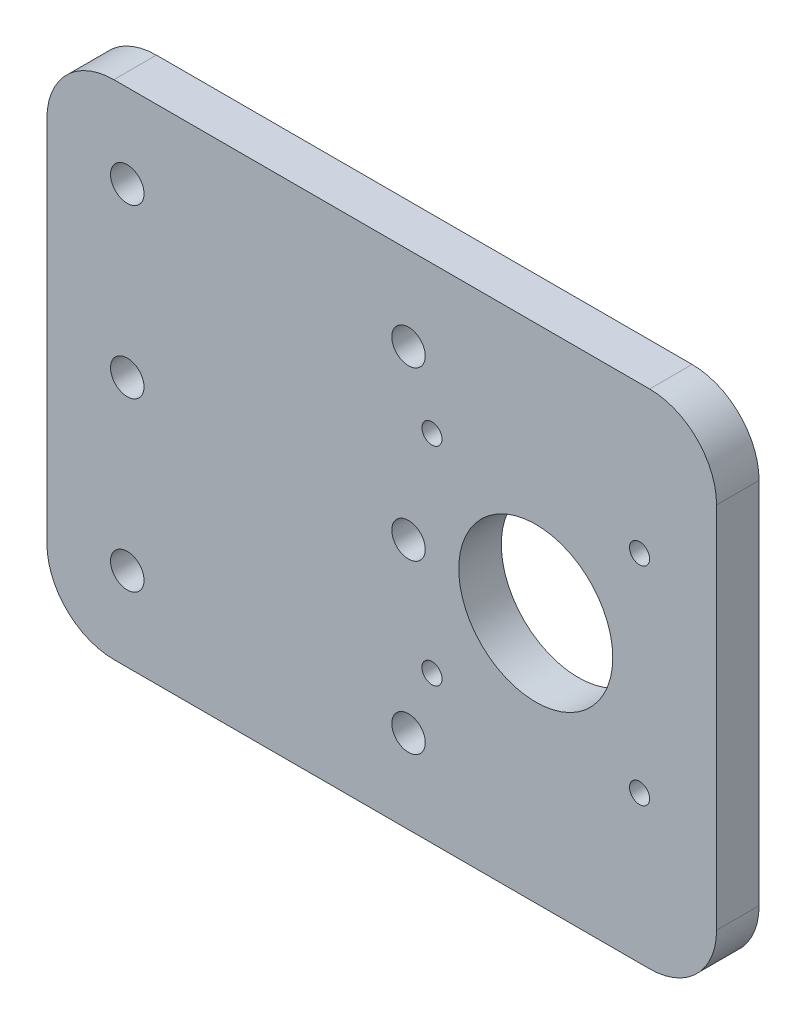
ISO-10303-21;
HEADER;
FILE_DESCRIPTION(('STEP AP214'),'2;1');
FILE_NAME('part.step','',(''),(''),'','','');
FILE_SCHEMA(('AUTOMOTIVE_DESIGN { 1 0 10303 214 1 1 1 1 }'));
ENDSEC;
DATA;
#1=APPLICATION_CONTEXT('core data for automotive mechanical design processes');
#2=APPLICATION_PROTOCOL_DEFINITION('international standard','automotive_design',2000,#1);
#3=PRODUCT_CONTEXT('',#1,'mechanical');
#4=PRODUCT('Part','Part','',(#3));
#5=PRODUCT_RELATED_PRODUCT_CATEGORY('part','',(#4));
#6=PRODUCT_DEFINITION_FORMATION('','',#4);
#7=PRODUCT_DEFINITION_CONTEXT('part definition',#1,'design');
#8=PRODUCT_DEFINITION('design','',#6,#7);
#9=PRODUCT_DEFINITION_SHAPE('','',#8);
#10=(LENGTH_UNIT() NAMED_UNIT(*) SI_UNIT(.MILLI.,.METRE.));
#11=(NAMED_UNIT(*) PLANE_ANGLE_UNIT() SI_UNIT($,.RADIAN.));
#12=(NAMED_UNIT(*) SI_UNIT($,.STERADIAN.) SOLID_ANGLE_UNIT());
#13=UNCERTAINTY_MEASURE_WITH_UNIT(LENGTH_MEASURE(1.E-05),#10,'distance_accuracy_value','');
#14=(GEOMETRIC_REPRESENTATION_CONTEXT(3) GLOBAL_UNCERTAINTY_ASSIGNED_CONTEXT((#13)) GLOBAL_UNIT_ASSIGNED_CONTEXT((#10,
#11,#12)) REPRESENTATION_CONTEXT('',''));
#15=CARTESIAN_POINT('',(0.,0.,0.));
#16=DIRECTION('',(0.,0.,1.));
#17=DIRECTION('',(1.,0.,0.));
#18=AXIS2_PLACEMENT_3D('',#15,#16,#17);
#19=CARTESIAN_POINT('',(0.,0.,6.35));
#20=DIRECTION('',(1.,0.,0.));
#21=DIRECTION('',(0.,0.,-1.));
#22=AXIS2_PLACEMENT_3D('',#19,#20,#21);
#23=PLANE('',#22);
#24=DIRECTION('',(0.,-1.,0.));
#25=VECTOR('',#24,1.);
#26=CARTESIAN_POINT('',(0.,0.,6.35));
#27=LINE('',#26,#25);
#28=CARTESIAN_POINT('',(0.,65.,6.35));
#29=VERTEX_POINT('',#28);
#30=CARTESIAN_POINT('',(0.,10.,6.35));
#31=VERTEX_POINT('',#30);
#32=EDGE_CURVE('E126',#29,#31,#27,.T.);
#33=ORIENTED_EDGE('',*,*,#32,.F.);
#34=DIRECTION('',(0.,0.,-1.));
#35=VECTOR('',#34,1.);
#36=CARTESIAN_POINT('',(0.,65.,6.35));
#37=LINE('',#36,#35);
#38=CARTESIAN_POINT('',(0.,65.,0.));
#39=VERTEX_POINT('',#38);
#40=EDGE_CURVE('E110',#29,#39,#37,.T.);
#41=ORIENTED_EDGE('',*,*,#40,.T.);
#42=DIRECTION('',(0.,-1.,0.));
#43=VECTOR('',#42,1.);
#44=CARTESIAN_POINT('',(0.,0.,0.));
#45=LINE('',#44,#43);
#46=CARTESIAN_POINT('',(0.,10.,0.));
#47=VERTEX_POINT('',#46);
#48=EDGE_CURVE('E123',#39,#47,#45,.T.);
#49=ORIENTED_EDGE('',*,*,#48,.T.);
#50=DIRECTION('',(0.,0.,-1.));
#51=VECTOR('',#50,1.);
#52=CARTESIAN_POINT('',(0.,10.,6.35));
#53=LINE('',#52,#51);
#54=EDGE_CURVE('E129',#47,#31,#53,.F.);
#55=ORIENTED_EDGE('',*,*,#54,.T.);
#56=EDGE_LOOP('',(#33,#41,#49,#55));
#57=FACE_BOUND('',#56,.T.);
#58=ADVANCED_FACE('F39',(#57),#23,.F.);
#59=CARTESIAN_POINT('',(0.,0.,6.35));
#60=DIRECTION('',(0.,1.,0.));
#61=DIRECTION('',(0.,0.,1.));
#62=AXIS2_PLACEMENT_3D('',#59,#60,#61);
#63=PLANE('',#62);
#64=DIRECTION('',(1.,0.,0.));
#65=VECTOR('',#64,1.);
#66=CARTESIAN_POINT('',(0.,0.,0.));
#67=LINE('',#66,#65);
#68=CARTESIAN_POINT('',(10.,0.,0.));
#69=VERTEX_POINT('',#68);
#70=CARTESIAN_POINT('',(90.,0.,0.));
#71=VERTEX_POINT('',#70);
#72=EDGE_CURVE('E135',#69,#71,#67,.T.);
#73=ORIENTED_EDGE('',*,*,#72,.T.);
#74=DIRECTION('',(0.,0.,-1.));
#75=VECTOR('',#74,1.);
#76=CARTESIAN_POINT('',(90.,0.,6.35));
#77=LINE('',#76,#75);
#78=CARTESIAN_POINT('',(90.,0.,6.35));
#79=VERTEX_POINT('',#78);
#80=EDGE_CURVE('E11',#71,#79,#77,.F.);
#81=ORIENTED_EDGE('',*,*,#80,.T.);
#82=DIRECTION('',(1.,0.,0.));
#83=VECTOR('',#82,1.);
#84=CARTESIAN_POINT('',(0.,0.,6.35));
#85=LINE('',#84,#83);
#86=CARTESIAN_POINT('',(10.,0.,6.35));
#87=VERTEX_POINT('',#86);
#88=EDGE_CURVE('E223',#87,#79,#85,.T.);
#89=ORIENTED_EDGE('',*,*,#88,.F.);
#90=DIRECTION('',(0.,0.,-1.));
#91=VECTOR('',#90,1.);
#92=CARTESIAN_POINT('',(10.,0.,6.35));
#93=LINE('',#92,#91);
#94=EDGE_CURVE('E48',#87,#69,#93,.T.);
#95=ORIENTED_EDGE('',*,*,#94,.T.);
#96=EDGE_LOOP('',(#73,#81,#89,#95));
#97=FACE_BOUND('',#96,.T.);
#98=ADVANCED_FACE('F221',(#97),#63,.F.);
#99=CARTESIAN_POINT('',(100.,0.,6.35));
#100=DIRECTION('',(-1.,0.,0.));
#101=DIRECTION('',(0.,0.,1.));
#102=AXIS2_PLACEMENT_3D('',#99,#100,#101);
#103=PLANE('',#102);
#104=DIRECTION('',(0.,1.,0.));
#105=VECTOR('',#104,1.);
#106=CARTESIAN_POINT('',(100.,0.,6.35));
#107=LINE('',#106,#105);
#108=CARTESIAN_POINT('',(100.,10.,6.35));
#109=VERTEX_POINT('',#108);
#110=CARTESIAN_POINT('',(100.,65.,6.35));
#111=VERTEX_POINT('',#110);
#112=EDGE_CURVE('E231',#109,#111,#107,.T.);
#113=ORIENTED_EDGE('',*,*,#112,.F.);
#114=DIRECTION('',(0.,0.,-1.));
#115=VECTOR('',#114,1.);
#116=CARTESIAN_POINT('',(100.,10.,6.35));
#117=LINE('',#116,#115);
#118=CARTESIAN_POINT('',(100.,10.,0.));
#119=VERTEX_POINT('',#118);
#120=EDGE_CURVE('E213',#109,#119,#117,.T.);
#121=ORIENTED_EDGE('',*,*,#120,.T.);
#122=DIRECTION('',(0.,1.,0.));
#123=VECTOR('',#122,1.);
#124=CARTESIAN_POINT('',(100.,0.,0.));
#125=LINE('',#124,#123);
#126=CARTESIAN_POINT('',(100.,65.,0.));
#127=VERTEX_POINT('',#126);
#128=EDGE_CURVE('E141',#119,#127,#125,.T.);
#129=ORIENTED_EDGE('',*,*,#128,.T.);
#130=DIRECTION('',(0.,0.,-1.));
#131=VECTOR('',#130,1.);
#132=CARTESIAN_POINT('',(100.,65.,6.35));
#133=LINE('',#132,#131);
#134=EDGE_CURVE('E55',#127,#111,#133,.F.);
#135=ORIENTED_EDGE('',*,*,#134,.T.);
#136=EDGE_LOOP('',(#113,#121,#129,#135));
#137=FACE_BOUND('',#136,.T.);
#138=ADVANCED_FACE('F230',(#137),#103,.F.);
#139=CARTESIAN_POINT('',(0.,75.,6.35));
#140=DIRECTION('',(0.,-1.,0.));
#141=DIRECTION('',(0.,0.,-1.));
#142=AXIS2_PLACEMENT_3D('',#139,#140,#141);
#143=PLANE('',#142);
#144=DIRECTION('',(-1.,0.,0.));
#145=VECTOR('',#144,1.);
#146=CARTESIAN_POINT('',(0.,75.,0.));
#147=LINE('',#146,#145);
#148=CARTESIAN_POINT('',(90.,75.,0.));
#149=VERTEX_POINT('',#148);
#150=CARTESIAN_POINT('',(10.,75.,0.));
#151=VERTEX_POINT('',#150);
#152=EDGE_CURVE('E152',#149,#151,#147,.T.);
#153=ORIENTED_EDGE('',*,*,#152,.T.);
#154=DIRECTION('',(0.,0.,-1.));
#155=VECTOR('',#154,1.);
#156=CARTESIAN_POINT('',(10.,75.,6.35));
#157=LINE('',#156,#155);
#158=CARTESIAN_POINT('',(10.,75.,6.35));
#159=VERTEX_POINT('',#158);
#160=EDGE_CURVE('E111',#151,#159,#157,.F.);
#161=ORIENTED_EDGE('',*,*,#160,.T.);
#162=DIRECTION('',(-1.,0.,0.));
#163=VECTOR('',#162,1.);
#164=CARTESIAN_POINT('',(0.,75.,6.35));
#165=LINE('',#164,#163);
#166=CARTESIAN_POINT('',(90.,75.,6.35));
#167=VERTEX_POINT('',#166);
#168=EDGE_CURVE('E147',#167,#159,#165,.T.);
#169=ORIENTED_EDGE('',*,*,#168,.F.);
#170=DIRECTION('',(0.,0.,-1.));
#171=VECTOR('',#170,1.);
#172=CARTESIAN_POINT('',(90.,75.,6.35));
#173=LINE('',#172,#171);
#174=EDGE_CURVE('E117',#167,#149,#173,.T.);
#175=ORIENTED_EDGE('',*,*,#174,.T.);
#176=EDGE_LOOP('',(#153,#161,#169,#175));
#177=FACE_BOUND('',#176,.T.);
#178=ADVANCED_FACE('F314',(#177),#143,.F.);
#179=CARTESIAN_POINT('',(0.,0.,6.35));
#180=DIRECTION('',(0.,0.,-1.));
#181=DIRECTION('',(-1.,0.,0.));
#182=AXIS2_PLACEMENT_3D('',#179,#180,#181);
#183=PLANE('',#182);
#184=CARTESIAN_POINT('',(57.5,53.,6.35));
#185=DIRECTION('',(0.,0.,1.));
#186=DIRECTION('',(1.,0.,0.));
#187=AXIS2_PLACEMENT_3D('',#184,#185,#186);
#188=CIRCLE('',#187,1.5);
#189=CARTESIAN_POINT('',(59.,53.,6.35));
#190=VERTEX_POINT('',#189);
#191=EDGE_CURVE('E288',#190,#190,#188,.T.);
#192=ORIENTED_EDGE('',*,*,#191,.F.);
#193=EDGE_LOOP('',(#192));
#194=FACE_BOUND('',#193,.T.);
#195=CARTESIAN_POINT('',(88.5,22.,6.35));
#196=DIRECTION('',(0.,0.,1.));
#197=DIRECTION('',(1.,0.,0.));
#198=AXIS2_PLACEMENT_3D('',#195,#196,#197);
#199=CIRCLE('',#198,1.5);
#200=CARTESIAN_POINT('',(90.,22.,6.35));
#201=VERTEX_POINT('',#200);
#202=EDGE_CURVE('E289',#201,#201,#199,.T.);
#203=ORIENTED_EDGE('',*,*,#202,.F.);
#204=EDGE_LOOP('',(#203));
#205=FACE_BOUND('',#204,.T.);
#206=CARTESIAN_POINT('',(57.5,22.,6.35));
#207=DIRECTION('',(0.,0.,1.));
#208=DIRECTION('',(1.,0.,0.));
#209=AXIS2_PLACEMENT_3D('',#206,#207,#208);
#210=CIRCLE('',#209,1.5);
#211=CARTESIAN_POINT('',(59.,22.,6.35));
#212=VERTEX_POINT('',#211);
#213=EDGE_CURVE('E293',#212,#212,#210,.T.);
#214=ORIENTED_EDGE('',*,*,#213,.F.);
#215=EDGE_LOOP('',(#214));
#216=FACE_BOUND('',#215,.T.);
#217=CARTESIAN_POINT('',(73.,37.5,6.35));
#218=DIRECTION('',(0.,0.,1.));
#219=DIRECTION('',(1.,0.,0.));
#220=AXIS2_PLACEMENT_3D('',#217,#218,#219);
#221=CIRCLE('',#220,11.5);
#222=CARTESIAN_POINT('',(84.5,37.5,6.35));
#223=VERTEX_POINT('',#222);
#224=EDGE_CURVE('E297',#223,#223,#221,.T.);
#225=ORIENTED_EDGE('',*,*,#224,.F.);
#226=EDGE_LOOP('',(#225));
#227=FACE_BOUND('',#226,.T.);
#228=CARTESIAN_POINT('',(88.5,53.,6.35));
#229=DIRECTION('',(0.,0.,1.));
#230=DIRECTION('',(1.,0.,0.));
#231=AXIS2_PLACEMENT_3D('',#228,#229,#230);
#232=CIRCLE('',#231,1.5);
#233=CARTESIAN_POINT('',(90.,53.,6.35));
#234=VERTEX_POINT('',#233);
#235=EDGE_CURVE('E281',#234,#234,#232,.T.);
#236=ORIENTED_EDGE('',*,*,#235,.F.);
#237=EDGE_LOOP('',(#236));
#238=FACE_BOUND('',#237,.T.);
#239=CARTESIAN_POINT('',(12.,37.5,6.35));
#240=DIRECTION('',(0.,0.,1.));
#241=DIRECTION('',(1.,0.,0.));
#242=AXIS2_PLACEMENT_3D('',#239,#240,#241);
#243=CIRCLE('',#242,2.5);
#244=CARTESIAN_POINT('',(14.5,37.5,6.35));
#245=VERTEX_POINT('',#244);
#246=EDGE_CURVE('E261',#245,#245,#243,.T.);
#247=ORIENTED_EDGE('',*,*,#246,.F.);
#248=EDGE_LOOP('',(#247));
#249=FACE_BOUND('',#248,.T.);
#250=CARTESIAN_POINT('',(54.,62.5,6.35));
#251=DIRECTION('',(0.,0.,1.));
#252=DIRECTION('',(1.,0.,0.));
#253=AXIS2_PLACEMENT_3D('',#250,#251,#252);
#254=CIRCLE('',#253,2.5);
#255=CARTESIAN_POINT('',(56.5,62.5,6.35));
#256=VERTEX_POINT('',#255);
#257=EDGE_CURVE('E270',#256,#256,#254,.T.);
#258=ORIENTED_EDGE('',*,*,#257,.F.);
#259=EDGE_LOOP('',(#258));
#260=FACE_BOUND('',#259,.T.);
#261=CARTESIAN_POINT('',(54.,37.5,6.35));
#262=DIRECTION('',(0.,0.,1.));
#263=DIRECTION('',(1.,0.,0.));
#264=AXIS2_PLACEMENT_3D('',#261,#262,#263);
#265=CIRCLE('',#264,2.5);
#266=CARTESIAN_POINT('',(56.5,37.5,6.35));
#267=VERTEX_POINT('',#266);
#268=EDGE_CURVE('E245',#267,#267,#265,.T.);
#269=ORIENTED_EDGE('',*,*,#268,.F.);
#270=EDGE_LOOP('',(#269));
#271=FACE_BOUND('',#270,.T.);
#272=CARTESIAN_POINT('',(12.,12.5,6.35));
#273=DIRECTION('',(0.,0.,1.));
#274=DIRECTION('',(1.,0.,0.));
#275=AXIS2_PLACEMENT_3D('',#272,#273,#274);
#276=CIRCLE('',#275,2.5);
#277=CARTESIAN_POINT('',(14.5,12.5,6.35));
#278=VERTEX_POINT('',#277);
#279=EDGE_CURVE('E254',#278,#278,#276,.T.);
#280=ORIENTED_EDGE('',*,*,#279,.F.);
#281=EDGE_LOOP('',(#280));
#282=FACE_BOUND('',#281,.T.);
#283=CARTESIAN_POINT('',(54.,12.5,6.35));
#284=DIRECTION('',(0.,0.,1.));
#285=DIRECTION('',(1.,0.,0.));
#286=AXIS2_PLACEMENT_3D('',#283,#284,#285);
#287=CIRCLE('',#286,2.5);
#288=CARTESIAN_POINT('',(56.5,12.5,6.35));
#289=VERTEX_POINT('',#288);
#290=EDGE_CURVE('E277',#289,#289,#287,.T.);
#291=ORIENTED_EDGE('',*,*,#290,.F.);
#292=EDGE_LOOP('',(#291));
#293=FACE_BOUND('',#292,.T.);
#294=CARTESIAN_POINT('',(12.,62.5,6.35));
#295=DIRECTION('',(0.,0.,1.));
#296=DIRECTION('',(1.,0.,0.));
#297=AXIS2_PLACEMENT_3D('',#294,#295,#296);
#298=CIRCLE('',#297,2.5);
#299=CARTESIAN_POINT('',(14.5,62.5,6.35));
#300=VERTEX_POINT('',#299);
#301=EDGE_CURVE('E144',#300,#300,#298,.T.);
#302=ORIENTED_EDGE('',*,*,#301,.F.);
#303=EDGE_LOOP('',(#302));
#304=FACE_BOUND('',#303,.T.);
#305=ORIENTED_EDGE('',*,*,#168,.T.);
#306=CARTESIAN_POINT('',(10.,65.,6.35));
#307=DIRECTION('',(0.,0.,-1.));
#308=DIRECTION('',(-1.,0.,0.));
#309=AXIS2_PLACEMENT_3D('',#306,#307,#308);
#310=CIRCLE('',#309,10.);
#311=EDGE_CURVE('E208',#159,#29,#310,.F.);
#312=ORIENTED_EDGE('',*,*,#311,.T.);
#313=ORIENTED_EDGE('',*,*,#32,.T.);
#314=CARTESIAN_POINT('',(10.,10.,6.35));
#315=DIRECTION('',(0.,0.,-1.));
#316=DIRECTION('',(-1.,0.,0.));
#317=AXIS2_PLACEMENT_3D('',#314,#315,#316);
#318=CIRCLE('',#317,10.);
#319=EDGE_CURVE('E203',#31,#87,#318,.F.);
#320=ORIENTED_EDGE('',*,*,#319,.T.);
#321=ORIENTED_EDGE('',*,*,#88,.T.);
#322=CARTESIAN_POINT('',(90.,10.,6.35));
#323=DIRECTION('',(0.,0.,-1.));
#324=DIRECTION('',(-1.,0.,0.));
#325=AXIS2_PLACEMENT_3D('',#322,#323,#324);
#326=CIRCLE('',#325,10.);
#327=EDGE_CURVE('E62',#79,#109,#326,.F.);
#328=ORIENTED_EDGE('',*,*,#327,.T.);
#329=ORIENTED_EDGE('',*,*,#112,.T.);
#330=CARTESIAN_POINT('',(90.,65.,6.35));
#331=DIRECTION('',(0.,0.,-1.));
#332=DIRECTION('',(-1.,0.,0.));
#333=AXIS2_PLACEMENT_3D('',#330,#331,#332);
#334=CIRCLE('',#333,10.);
#335=EDGE_CURVE('E200',#111,#167,#334,.F.);
#336=ORIENTED_EDGE('',*,*,#335,.T.);
#337=EDGE_LOOP('',(#305,#312,#313,#320,#321,#328,#329,#336));
#338=FACE_BOUND('',#337,.T.);
#339=ADVANCED_FACE('F311',(#194,#205,#216,#227,#238,#249,#260,#271,#282,#293,#304,#338),#183,.F.);
#340=CARTESIAN_POINT('',(0.,0.,0.));
#341=DIRECTION('',(0.,0.,-1.));
#342=DIRECTION('',(-1.,0.,0.));
#343=AXIS2_PLACEMENT_3D('',#340,#341,#342);
#344=PLANE('',#343);
#345=CARTESIAN_POINT('',(88.5,22.,0.));
#346=DIRECTION('',(0.,0.,-1.));
#347=DIRECTION('',(-1.,0.,0.));
#348=AXIS2_PLACEMENT_3D('',#345,#346,#347);
#349=CIRCLE('',#348,3.00000000000004);
#350=CARTESIAN_POINT('',(85.4999999999999,22.,0.));
#351=VERTEX_POINT('',#350);
#352=EDGE_CURVE('E167',#351,#351,#349,.F.);
#353=ORIENTED_EDGE('',*,*,#352,.T.);
#354=EDGE_LOOP('',(#353));
#355=FACE_BOUND('',#354,.T.);
#356=CARTESIAN_POINT('',(57.5,22.,0.));
#357=DIRECTION('',(0.,0.,-1.));
#358=DIRECTION('',(-1.,0.,0.));
#359=AXIS2_PLACEMENT_3D('',#356,#357,#358);
#360=CIRCLE('',#359,2.99999999999999);
#361=CARTESIAN_POINT('',(54.5,22.,0.));
#362=VERTEX_POINT('',#361);
#363=EDGE_CURVE('E163',#362,#362,#360,.F.);
#364=ORIENTED_EDGE('',*,*,#363,.T.);
#365=EDGE_LOOP('',(#364));
#366=FACE_BOUND('',#365,.T.);
#367=CARTESIAN_POINT('',(88.5,53.,0.));
#368=DIRECTION('',(0.,0.,-1.));
#369=DIRECTION('',(-1.,0.,0.));
#370=AXIS2_PLACEMENT_3D('',#367,#368,#369);
#371=CIRCLE('',#370,3.00000000000004);
#372=CARTESIAN_POINT('',(85.4999999999999,53.,0.));
#373=VERTEX_POINT('',#372);
#374=EDGE_CURVE('E159',#373,#373,#371,.F.);
#375=ORIENTED_EDGE('',*,*,#374,.T.);
#376=EDGE_LOOP('',(#375));
#377=FACE_BOUND('',#376,.T.);
#378=CARTESIAN_POINT('',(57.5,53.,0.));
#379=DIRECTION('',(0.,0.,-1.));
#380=DIRECTION('',(-1.,0.,0.));
#381=AXIS2_PLACEMENT_3D('',#378,#379,#380);
#382=CIRCLE('',#381,2.99999999999999);
#383=CARTESIAN_POINT('',(54.5,53.,0.));
#384=VERTEX_POINT('',#383);
#385=EDGE_CURVE('E155',#384,#384,#382,.F.);
#386=ORIENTED_EDGE('',*,*,#385,.T.);
#387=EDGE_LOOP('',(#386));
#388=FACE_BOUND('',#387,.T.);
#389=CARTESIAN_POINT('',(73.,37.5,0.));
#390=DIRECTION('',(0.,0.,1.));
#391=DIRECTION('',(1.,0.,0.));
#392=AXIS2_PLACEMENT_3D('',#389,#390,#391);
#393=CIRCLE('',#392,11.5);
#394=CARTESIAN_POINT('',(84.5,37.5,0.));
#395=VERTEX_POINT('',#394);
#396=EDGE_CURVE('E301',#395,#395,#393,.T.);
#397=ORIENTED_EDGE('',*,*,#396,.T.);
#398=EDGE_LOOP('',(#397));
#399=FACE_BOUND('',#398,.T.);
#400=CARTESIAN_POINT('',(12.,37.5,0.));
#401=DIRECTION('',(0.,0.,1.));
#402=DIRECTION('',(1.,0.,0.));
#403=AXIS2_PLACEMENT_3D('',#400,#401,#402);
#404=CIRCLE('',#403,2.5);
#405=CARTESIAN_POINT('',(14.5,37.5,0.));
#406=VERTEX_POINT('',#405);
#407=EDGE_CURVE('E265',#406,#406,#404,.T.);
#408=ORIENTED_EDGE('',*,*,#407,.T.);
#409=EDGE_LOOP('',(#408));
#410=FACE_BOUND('',#409,.T.);
#411=CARTESIAN_POINT('',(54.,62.5,0.));
#412=DIRECTION('',(0.,0.,1.));
#413=DIRECTION('',(1.,0.,0.));
#414=AXIS2_PLACEMENT_3D('',#411,#412,#413);
#415=CIRCLE('',#414,2.5);
#416=CARTESIAN_POINT('',(56.5,62.5,0.));
#417=VERTEX_POINT('',#416);
#418=EDGE_CURVE('E250',#417,#417,#415,.T.);
#419=ORIENTED_EDGE('',*,*,#418,.T.);
#420=EDGE_LOOP('',(#419));
#421=FACE_BOUND('',#420,.T.);
#422=CARTESIAN_POINT('',(54.,37.5,0.));
#423=DIRECTION('',(0.,0.,1.));
#424=DIRECTION('',(1.,0.,0.));
#425=AXIS2_PLACEMENT_3D('',#422,#423,#424);
#426=CIRCLE('',#425,2.5);
#427=CARTESIAN_POINT('',(56.5,37.5,0.));
#428=VERTEX_POINT('',#427);
#429=EDGE_CURVE('E249',#428,#428,#426,.T.);
#430=ORIENTED_EDGE('',*,*,#429,.T.);
#431=EDGE_LOOP('',(#430));
#432=FACE_BOUND('',#431,.T.);
#433=CARTESIAN_POINT('',(12.,12.5,0.));
#434=DIRECTION('',(0.,0.,1.));
#435=DIRECTION('',(1.,0.,0.));
#436=AXIS2_PLACEMENT_3D('',#433,#434,#435);
#437=CIRCLE('',#436,2.5);
#438=CARTESIAN_POINT('',(14.5,12.5,0.));
#439=VERTEX_POINT('',#438);
#440=EDGE_CURVE('E243',#439,#439,#437,.T.);
#441=ORIENTED_EDGE('',*,*,#440,.T.);
#442=EDGE_LOOP('',(#441));
#443=FACE_BOUND('',#442,.T.);
#444=CARTESIAN_POINT('',(54.,12.5,0.));
#445=DIRECTION('',(0.,0.,1.));
#446=DIRECTION('',(1.,0.,0.));
#447=AXIS2_PLACEMENT_3D('',#444,#445,#446);
#448=CIRCLE('',#447,2.5);
#449=CARTESIAN_POINT('',(56.5,12.5,0.));
#450=VERTEX_POINT('',#449);
#451=EDGE_CURVE('E266',#450,#450,#448,.T.);
#452=ORIENTED_EDGE('',*,*,#451,.T.);
#453=EDGE_LOOP('',(#452));
#454=FACE_BOUND('',#453,.T.);
#455=CARTESIAN_POINT('',(12.,62.5,0.));
#456=DIRECTION('',(0.,0.,1.));
#457=DIRECTION('',(1.,0.,0.));
#458=AXIS2_PLACEMENT_3D('',#455,#456,#457);
#459=CIRCLE('',#458,2.5);
#460=CARTESIAN_POINT('',(14.5,62.5,0.));
#461=VERTEX_POINT('',#460);
#462=EDGE_CURVE('E136',#461,#461,#459,.T.);
#463=ORIENTED_EDGE('',*,*,#462,.T.);
#464=EDGE_LOOP('',(#463));
#465=FACE_BOUND('',#464,.T.);
#466=ORIENTED_EDGE('',*,*,#48,.F.);
#467=CARTESIAN_POINT('',(10.,65.,0.));
#468=DIRECTION('',(0.,0.,-1.));
#469=DIRECTION('',(-1.,0.,0.));
#470=AXIS2_PLACEMENT_3D('',#467,#468,#469);
#471=CIRCLE('',#470,10.);
#472=EDGE_CURVE('E106',#39,#151,#471,.T.);
#473=ORIENTED_EDGE('',*,*,#472,.T.);
#474=ORIENTED_EDGE('',*,*,#152,.F.);
#475=CARTESIAN_POINT('',(90.,65.,0.));
#476=DIRECTION('',(0.,0.,-1.));
#477=DIRECTION('',(-1.,0.,0.));
#478=AXIS2_PLACEMENT_3D('',#475,#476,#477);
#479=CIRCLE('',#478,10.);
#480=EDGE_CURVE('E128',#149,#127,#479,.T.);
#481=ORIENTED_EDGE('',*,*,#480,.T.);
#482=ORIENTED_EDGE('',*,*,#128,.F.);
#483=CARTESIAN_POINT('',(90.,10.,0.));
#484=DIRECTION('',(0.,0.,-1.));
#485=DIRECTION('',(-1.,0.,0.));
#486=AXIS2_PLACEMENT_3D('',#483,#484,#485);
#487=CIRCLE('',#486,10.);
#488=EDGE_CURVE('E118',#119,#71,#487,.T.);
#489=ORIENTED_EDGE('',*,*,#488,.T.);
#490=ORIENTED_EDGE('',*,*,#72,.F.);
#491=CARTESIAN_POINT('',(10.,10.,0.));
#492=DIRECTION('',(0.,0.,-1.));
#493=DIRECTION('',(-1.,0.,0.));
#494=AXIS2_PLACEMENT_3D('',#491,#492,#493);
#495=CIRCLE('',#494,10.);
#496=EDGE_CURVE('E133',#69,#47,#495,.T.);
#497=ORIENTED_EDGE('',*,*,#496,.T.);
#498=EDGE_LOOP('',(#466,#473,#474,#481,#482,#489,#490,#497));
#499=FACE_BOUND('',#498,.T.);
#500=ADVANCED_FACE('F131',(#355,#366,#377,#388,#399,#410,#421,#432,#443,#454,#465,#499),#344,.T.);
#501=CARTESIAN_POINT('',(12.,62.5,0.));
#502=DIRECTION('',(0.,0.,1.));
#503=DIRECTION('',(1.,0.,0.));
#504=AXIS2_PLACEMENT_3D('',#501,#502,#503);
#505=CYLINDRICAL_SURFACE('',#504,2.5);
#506=ORIENTED_EDGE('',*,*,#462,.F.);
#507=EDGE_LOOP('',(#506));
#508=FACE_BOUND('',#507,.T.);
#509=ORIENTED_EDGE('',*,*,#301,.T.);
#510=EDGE_LOOP('',(#509));
#511=FACE_BOUND('',#510,.T.);
#512=ADVANCED_FACE('F498',(#508,#511),#505,.F.);
#513=CARTESIAN_POINT('',(54.,12.5,0.));
#514=DIRECTION('',(0.,0.,1.));
#515=DIRECTION('',(1.,0.,0.));
#516=AXIS2_PLACEMENT_3D('',#513,#514,#515);
#517=CYLINDRICAL_SURFACE('',#516,2.5);
#518=ORIENTED_EDGE('',*,*,#451,.F.);
#519=EDGE_LOOP('',(#518));
#520=FACE_BOUND('',#519,.T.);
#521=ORIENTED_EDGE('',*,*,#290,.T.);
#522=EDGE_LOOP('',(#521));
#523=FACE_BOUND('',#522,.T.);
#524=ADVANCED_FACE('F489',(#520,#523),#517,.F.);
#525=CARTESIAN_POINT('',(12.,12.5,0.));
#526=DIRECTION('',(0.,0.,1.));
#527=DIRECTION('',(1.,0.,0.));
#528=AXIS2_PLACEMENT_3D('',#525,#526,#527);
#529=CYLINDRICAL_SURFACE('',#528,2.5);
#530=ORIENTED_EDGE('',*,*,#440,.F.);
#531=EDGE_LOOP('',(#530));
#532=FACE_BOUND('',#531,.T.);
#533=ORIENTED_EDGE('',*,*,#279,.T.);
#534=EDGE_LOOP('',(#533));
#535=FACE_BOUND('',#534,.T.);
#536=ADVANCED_FACE('F480',(#532,#535),#529,.F.);
#537=CARTESIAN_POINT('',(54.,37.5,0.));
#538=DIRECTION('',(0.,0.,1.));
#539=DIRECTION('',(1.,0.,0.));
#540=AXIS2_PLACEMENT_3D('',#537,#538,#539);
#541=CYLINDRICAL_SURFACE('',#540,2.5);
#542=ORIENTED_EDGE('',*,*,#429,.F.);
#543=EDGE_LOOP('',(#542));
#544=FACE_BOUND('',#543,.T.);
#545=ORIENTED_EDGE('',*,*,#268,.T.);
#546=EDGE_LOOP('',(#545));
#547=FACE_BOUND('',#546,.T.);
#548=ADVANCED_FACE('F471',(#544,#547),#541,.F.);
#549=CARTESIAN_POINT('',(54.,62.5,0.));
#550=DIRECTION('',(0.,0.,1.));
#551=DIRECTION('',(1.,0.,0.));
#552=AXIS2_PLACEMENT_3D('',#549,#550,#551);
#553=CYLINDRICAL_SURFACE('',#552,2.5);
#554=ORIENTED_EDGE('',*,*,#418,.F.);
#555=EDGE_LOOP('',(#554));
#556=FACE_BOUND('',#555,.T.);
#557=ORIENTED_EDGE('',*,*,#257,.T.);
#558=EDGE_LOOP('',(#557));
#559=FACE_BOUND('',#558,.T.);
#560=ADVANCED_FACE('F462',(#556,#559),#553,.F.);
#561=CARTESIAN_POINT('',(12.,37.5,0.));
#562=DIRECTION('',(0.,0.,1.));
#563=DIRECTION('',(1.,0.,0.));
#564=AXIS2_PLACEMENT_3D('',#561,#562,#563);
#565=CYLINDRICAL_SURFACE('',#564,2.5);
#566=ORIENTED_EDGE('',*,*,#407,.F.);
#567=EDGE_LOOP('',(#566));
#568=FACE_BOUND('',#567,.T.);
#569=ORIENTED_EDGE('',*,*,#246,.T.);
#570=EDGE_LOOP('',(#569));
#571=FACE_BOUND('',#570,.T.);
#572=ADVANCED_FACE('F454',(#568,#571),#565,.F.);
#573=CARTESIAN_POINT('',(88.5,53.,0.));
#574=DIRECTION('',(0.,0.,1.));
#575=DIRECTION('',(1.,0.,0.));
#576=AXIS2_PLACEMENT_3D('',#573,#574,#575);
#577=CYLINDRICAL_SURFACE('',#576,1.5);
#578=CARTESIAN_POINT('',(88.5,53.,1.50000000000002));
#579=DIRECTION('',(0.,0.,-1.));
#580=DIRECTION('',(-1.,0.,0.));
#581=AXIS2_PLACEMENT_3D('',#578,#579,#580);
#582=CIRCLE('',#581,1.5);
#583=CARTESIAN_POINT('',(87.,53.,1.50000000000002));
#584=VERTEX_POINT('',#583);
#585=EDGE_CURVE('E179',#584,#584,#582,.T.);
#586=ORIENTED_EDGE('',*,*,#585,.T.);
#587=EDGE_LOOP('',(#586));
#588=FACE_BOUND('',#587,.T.);
#589=ORIENTED_EDGE('',*,*,#235,.T.);
#590=EDGE_LOOP('',(#589));
#591=FACE_BOUND('',#590,.T.);
#592=ADVANCED_FACE('F445',(#588,#591),#577,.F.);
#593=CARTESIAN_POINT('',(73.,37.5,0.));
#594=DIRECTION('',(0.,0.,1.));
#595=DIRECTION('',(1.,0.,0.));
#596=AXIS2_PLACEMENT_3D('',#593,#594,#595);
#597=CYLINDRICAL_SURFACE('',#596,11.5);
#598=ORIENTED_EDGE('',*,*,#396,.F.);
#599=EDGE_LOOP('',(#598));
#600=FACE_BOUND('',#599,.T.);
#601=ORIENTED_EDGE('',*,*,#224,.T.);
#602=EDGE_LOOP('',(#601));
#603=FACE_BOUND('',#602,.T.);
#604=ADVANCED_FACE('F435',(#600,#603),#597,.F.);
#605=CARTESIAN_POINT('',(57.5,22.,0.));
#606=DIRECTION('',(0.,0.,1.));
#607=DIRECTION('',(1.,0.,0.));
#608=AXIS2_PLACEMENT_3D('',#605,#606,#607);
#609=CYLINDRICAL_SURFACE('',#608,1.5);
#610=CARTESIAN_POINT('',(57.5,22.,1.49999999999999));
#611=DIRECTION('',(0.,0.,-1.));
#612=DIRECTION('',(-1.,0.,0.));
#613=AXIS2_PLACEMENT_3D('',#610,#611,#612);
#614=CIRCLE('',#613,1.5);
#615=CARTESIAN_POINT('',(56.,22.,1.49999999999999));
#616=VERTEX_POINT('',#615);
#617=EDGE_CURVE('E175',#616,#616,#614,.T.);
#618=ORIENTED_EDGE('',*,*,#617,.T.);
#619=EDGE_LOOP('',(#618));
#620=FACE_BOUND('',#619,.T.);
#621=ORIENTED_EDGE('',*,*,#213,.T.);
#622=EDGE_LOOP('',(#621));
#623=FACE_BOUND('',#622,.T.);
#624=ADVANCED_FACE('F309',(#620,#623),#609,.F.);
#625=CARTESIAN_POINT('',(88.5,22.,0.));
#626=DIRECTION('',(0.,0.,1.));
#627=DIRECTION('',(1.,0.,0.));
#628=AXIS2_PLACEMENT_3D('',#625,#626,#627);
#629=CYLINDRICAL_SURFACE('',#628,1.5);
#630=CARTESIAN_POINT('',(88.5,22.,1.50000000000002));
#631=DIRECTION('',(0.,0.,-1.));
#632=DIRECTION('',(-1.,0.,0.));
#633=AXIS2_PLACEMENT_3D('',#630,#631,#632);
#634=CIRCLE('',#633,1.5);
#635=CARTESIAN_POINT('',(87.,22.,1.50000000000002));
#636=VERTEX_POINT('',#635);
#637=EDGE_CURVE('E171',#636,#636,#634,.T.);
#638=ORIENTED_EDGE('',*,*,#637,.T.);
#639=EDGE_LOOP('',(#638));
#640=FACE_BOUND('',#639,.T.);
#641=ORIENTED_EDGE('',*,*,#202,.T.);
#642=EDGE_LOOP('',(#641));
#643=FACE_BOUND('',#642,.T.);
#644=ADVANCED_FACE('F418',(#640,#643),#629,.F.);
#645=CARTESIAN_POINT('',(57.5,53.,0.));
#646=DIRECTION('',(0.,0.,1.));
#647=DIRECTION('',(1.,0.,0.));
#648=AXIS2_PLACEMENT_3D('',#645,#646,#647);
#649=CYLINDRICAL_SURFACE('',#648,1.5);
#650=CARTESIAN_POINT('',(57.5,53.,1.49999999999999));
#651=DIRECTION('',(0.,0.,-1.));
#652=DIRECTION('',(-1.,0.,0.));
#653=AXIS2_PLACEMENT_3D('',#650,#651,#652);
#654=CIRCLE('',#653,1.5);
#655=CARTESIAN_POINT('',(56.,53.,1.49999999999999));
#656=VERTEX_POINT('',#655);
#657=EDGE_CURVE('E183',#656,#656,#654,.T.);
#658=ORIENTED_EDGE('',*,*,#657,.T.);
#659=EDGE_LOOP('',(#658));
#660=FACE_BOUND('',#659,.T.);
#661=ORIENTED_EDGE('',*,*,#191,.T.);
#662=EDGE_LOOP('',(#661));
#663=FACE_BOUND('',#662,.T.);
#664=ADVANCED_FACE('F353',(#660,#663),#649,.F.);
#665=CARTESIAN_POINT('',(88.5,22.,0.));
#666=DIRECTION('',(0.,0.,-1.));
#667=DIRECTION('',(-1.,0.,0.));
#668=AXIS2_PLACEMENT_3D('',#665,#666,#667);
#669=CONICAL_SURFACE('',#668,3.00000000000004,0.785398163397456);
#670=ORIENTED_EDGE('',*,*,#637,.F.);
#671=EDGE_LOOP('',(#670));
#672=FACE_BOUND('',#671,.T.);
#673=ORIENTED_EDGE('',*,*,#352,.F.);
#674=EDGE_LOOP('',(#673));
#675=FACE_BOUND('',#674,.T.);
#676=ADVANCED_FACE('F349',(#672,#675),#669,.F.);
#677=CARTESIAN_POINT('',(57.5,22.,0.));
#678=DIRECTION('',(0.,0.,-1.));
#679=DIRECTION('',(-1.,0.,0.));
#680=AXIS2_PLACEMENT_3D('',#677,#678,#679);
#681=CONICAL_SURFACE('',#680,2.99999999999999,0.785398163397447);
#682=ORIENTED_EDGE('',*,*,#617,.F.);
#683=EDGE_LOOP('',(#682));
#684=FACE_BOUND('',#683,.T.);
#685=ORIENTED_EDGE('',*,*,#363,.F.);
#686=EDGE_LOOP('',(#685));
#687=FACE_BOUND('',#686,.T.);
#688=ADVANCED_FACE('F352',(#684,#687),#681,.F.);
#689=CARTESIAN_POINT('',(88.5,53.,0.));
#690=DIRECTION('',(0.,0.,-1.));
#691=DIRECTION('',(-1.,0.,0.));
#692=AXIS2_PLACEMENT_3D('',#689,#690,#691);
#693=CONICAL_SURFACE('',#692,3.00000000000004,0.785398163397456);
#694=ORIENTED_EDGE('',*,*,#585,.F.);
#695=EDGE_LOOP('',(#694));
#696=FACE_BOUND('',#695,.T.);
#697=ORIENTED_EDGE('',*,*,#374,.F.);
#698=EDGE_LOOP('',(#697));
#699=FACE_BOUND('',#698,.T.);
#700=ADVANCED_FACE('F357',(#696,#699),#693,.F.);
#701=CARTESIAN_POINT('',(57.5,53.,0.));
#702=DIRECTION('',(0.,0.,-1.));
#703=DIRECTION('',(-1.,0.,0.));
#704=AXIS2_PLACEMENT_3D('',#701,#702,#703);
#705=CONICAL_SURFACE('',#704,2.99999999999999,0.785398163397447);
#706=ORIENTED_EDGE('',*,*,#657,.F.);
#707=EDGE_LOOP('',(#706));
#708=FACE_BOUND('',#707,.T.);
#709=ORIENTED_EDGE('',*,*,#385,.F.);
#710=EDGE_LOOP('',(#709));
#711=FACE_BOUND('',#710,.T.);
#712=ADVANCED_FACE('F361',(#708,#711),#705,.F.);
#713=CARTESIAN_POINT('',(10.,65.,6.35));
#714=DIRECTION('',(0.,0.,-1.));
#715=DIRECTION('',(-1.,0.,0.));
#716=AXIS2_PLACEMENT_3D('',#713,#714,#715);
#717=CYLINDRICAL_SURFACE('',#716,10.);
#718=ORIENTED_EDGE('',*,*,#311,.F.);
#719=ORIENTED_EDGE('',*,*,#160,.F.);
#720=ORIENTED_EDGE('',*,*,#472,.F.);
#721=ORIENTED_EDGE('',*,*,#40,.F.);
#722=EDGE_LOOP('',(#718,#719,#720,#721));
#723=FACE_BOUND('',#722,.T.);
#724=ADVANCED_FACE('F109',(#723),#717,.T.);
#725=CARTESIAN_POINT('',(90.,10.,6.35));
#726=DIRECTION('',(0.,0.,-1.));
#727=DIRECTION('',(-1.,0.,0.));
#728=AXIS2_PLACEMENT_3D('',#725,#726,#727);
#729=CYLINDRICAL_SURFACE('',#728,10.);
#730=ORIENTED_EDGE('',*,*,#327,.F.);
#731=ORIENTED_EDGE('',*,*,#80,.F.);
#732=ORIENTED_EDGE('',*,*,#488,.F.);
#733=ORIENTED_EDGE('',*,*,#120,.F.);
#734=EDGE_LOOP('',(#730,#731,#732,#733));
#735=FACE_BOUND('',#734,.T.);
#736=ADVANCED_FACE('F229',(#735),#729,.T.);
#737=CARTESIAN_POINT('',(10.,10.,6.35));
#738=DIRECTION('',(0.,0.,-1.));
#739=DIRECTION('',(-1.,0.,0.));
#740=AXIS2_PLACEMENT_3D('',#737,#738,#739);
#741=CYLINDRICAL_SURFACE('',#740,10.);
#742=ORIENTED_EDGE('',*,*,#319,.F.);
#743=ORIENTED_EDGE('',*,*,#54,.F.);
#744=ORIENTED_EDGE('',*,*,#496,.F.);
#745=ORIENTED_EDGE('',*,*,#94,.F.);
#746=EDGE_LOOP('',(#742,#743,#744,#745));
#747=FACE_BOUND('',#746,.T.);
#748=ADVANCED_FACE('F337',(#747),#741,.T.);
#749=CARTESIAN_POINT('',(90.,65.,6.35));
#750=DIRECTION('',(0.,0.,-1.));
#751=DIRECTION('',(-1.,0.,0.));
#752=AXIS2_PLACEMENT_3D('',#749,#750,#751);
#753=CYLINDRICAL_SURFACE('',#752,10.);
#754=ORIENTED_EDGE('',*,*,#335,.F.);
#755=ORIENTED_EDGE('',*,*,#134,.F.);
#756=ORIENTED_EDGE('',*,*,#480,.F.);
#757=ORIENTED_EDGE('',*,*,#174,.F.);
#758=EDGE_LOOP('',(#754,#755,#756,#757));
#759=FACE_BOUND('',#758,.T.);
#760=ADVANCED_FACE('F41',(#759),#753,.T.);
#761=CLOSED_SHELL('',(#58,#98,#138,#178,#339,#500,#512,#524,#536,#548,#560,#572,#592,#604,#624,
#644,#664,#676,#688,#700,#712,#724,#736,#748,#760));
#762=MANIFOLD_SOLID_BREP('B2',#761);
#763=ADVANCED_BREP_SHAPE_REPRESENTATION('',(#18,#762),#14);
#764=SHAPE_DEFINITION_REPRESENTATION(#9,#763);
ENDSEC;
END-ISO-10303-21;
